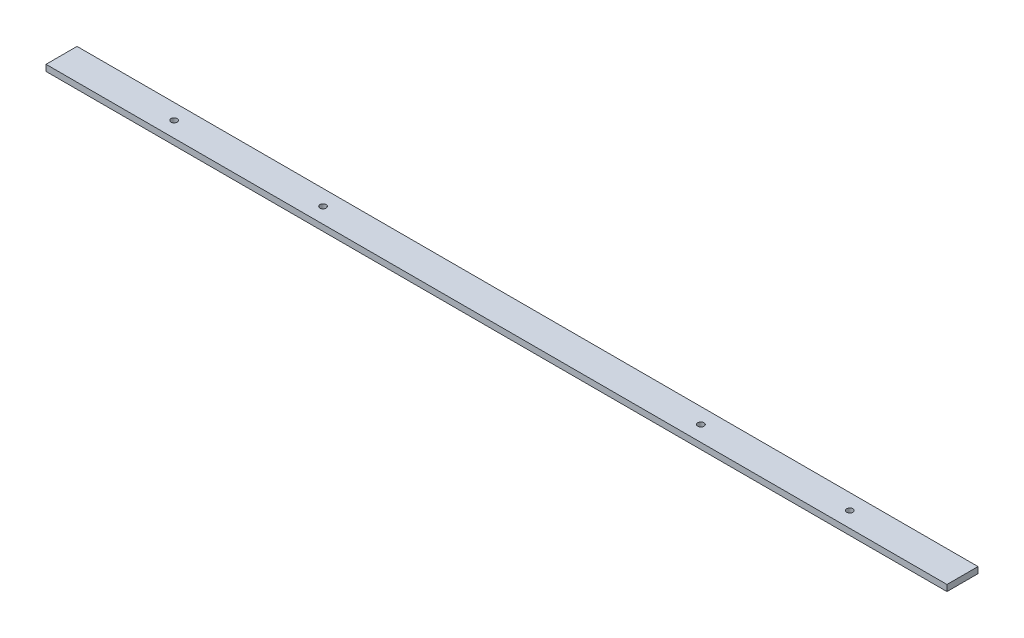
ISO-10303-21;
HEADER;
FILE_DESCRIPTION(('STEP AP214'),'2;1');
FILE_NAME('part.step','',(''),(''),'','','');
FILE_SCHEMA(('AUTOMOTIVE_DESIGN { 1 0 10303 214 1 1 1 1 }'));
ENDSEC;
DATA;
#1=APPLICATION_CONTEXT('core data for automotive mechanical design processes');
#2=APPLICATION_PROTOCOL_DEFINITION('international standard','automotive_design',2000,#1);
#3=PRODUCT_CONTEXT('',#1,'mechanical');
#4=PRODUCT('Part','Part','',(#3));
#5=PRODUCT_RELATED_PRODUCT_CATEGORY('part','',(#4));
#6=PRODUCT_DEFINITION_FORMATION('','',#4);
#7=PRODUCT_DEFINITION_CONTEXT('part definition',#1,'design');
#8=PRODUCT_DEFINITION('design','',#6,#7);
#9=PRODUCT_DEFINITION_SHAPE('','',#8);
#10=(LENGTH_UNIT() NAMED_UNIT(*) SI_UNIT(.MILLI.,.METRE.));
#11=(NAMED_UNIT(*) PLANE_ANGLE_UNIT() SI_UNIT($,.RADIAN.));
#12=(NAMED_UNIT(*) SI_UNIT($,.STERADIAN.) SOLID_ANGLE_UNIT());
#13=UNCERTAINTY_MEASURE_WITH_UNIT(LENGTH_MEASURE(1.E-05),#10,'distance_accuracy_value','');
#14=(GEOMETRIC_REPRESENTATION_CONTEXT(3) GLOBAL_UNCERTAINTY_ASSIGNED_CONTEXT((#13)) GLOBAL_UNIT_ASSIGNED_CONTEXT((#10,
#11,#12)) REPRESENTATION_CONTEXT('',''));
#15=CARTESIAN_POINT('',(0.,0.,0.));
#16=DIRECTION('',(0.,0.,1.));
#17=DIRECTION('',(1.,0.,0.));
#18=AXIS2_PLACEMENT_3D('',#15,#16,#17);
#19=CARTESIAN_POINT('',(-45.7662531369506,-2.,0.));
#20=DIRECTION('',(-1.,0.,0.));
#21=DIRECTION('',(0.,0.,1.));
#22=AXIS2_PLACEMENT_3D('',#19,#20,#21);
#23=PLANE('',#22);
#24=DIRECTION('',(0.,0.,1.));
#25=VECTOR('',#24,1.);
#26=CARTESIAN_POINT('',(-45.7662531369506,0.,0.));
#27=LINE('',#26,#25);
#28=CARTESIAN_POINT('',(-45.7662531369506,0.,0.));
#29=VERTEX_POINT('',#28);
#30=CARTESIAN_POINT('',(-45.7662531369506,0.,10.));
#31=VERTEX_POINT('',#30);
#32=EDGE_CURVE('E103',#29,#31,#27,.T.);
#33=ORIENTED_EDGE('',*,*,#32,.F.);
#34=DIRECTION('',(0.,1.,0.));
#35=VECTOR('',#34,1.);
#36=CARTESIAN_POINT('',(-45.7662531369506,-2.,0.));
#37=LINE('',#36,#35);
#38=CARTESIAN_POINT('',(-45.7662531369506,-2.,0.));
#39=VERTEX_POINT('',#38);
#40=EDGE_CURVE('E11',#39,#29,#37,.T.);
#41=ORIENTED_EDGE('',*,*,#40,.F.);
#42=DIRECTION('',(0.,0.,1.));
#43=VECTOR('',#42,1.);
#44=CARTESIAN_POINT('',(-45.7662531369506,-2.,0.));
#45=LINE('',#44,#43);
#46=CARTESIAN_POINT('',(-45.7662531369506,-2.,10.));
#47=VERTEX_POINT('',#46);
#48=EDGE_CURVE('E96',#39,#47,#45,.T.);
#49=ORIENTED_EDGE('',*,*,#48,.T.);
#50=DIRECTION('',(0.,1.,0.));
#51=VECTOR('',#50,1.);
#52=CARTESIAN_POINT('',(-45.7662531369506,-2.,10.));
#53=LINE('',#52,#51);
#54=EDGE_CURVE('E41',#47,#31,#53,.T.);
#55=ORIENTED_EDGE('',*,*,#54,.T.);
#56=EDGE_LOOP('',(#33,#41,#49,#55));
#57=FACE_BOUND('',#56,.T.);
#58=ADVANCED_FACE('F38',(#57),#23,.T.);
#59=CARTESIAN_POINT('',(-45.7662531369506,-2.,0.));
#60=DIRECTION('',(0.,0.,-1.));
#61=DIRECTION('',(-1.,0.,0.));
#62=AXIS2_PLACEMENT_3D('',#59,#60,#61);
#63=PLANE('',#62);
#64=DIRECTION('',(-1.,0.,0.));
#65=VECTOR('',#64,1.);
#66=CARTESIAN_POINT('',(-45.7662531369506,0.,0.));
#67=LINE('',#66,#65);
#68=CARTESIAN_POINT('',(244.583746863049,0.,0.));
#69=VERTEX_POINT('',#68);
#70=EDGE_CURVE('E98',#69,#29,#67,.T.);
#71=ORIENTED_EDGE('',*,*,#70,.F.);
#72=DIRECTION('',(0.,1.,0.));
#73=VECTOR('',#72,1.);
#74=CARTESIAN_POINT('',(244.583746863049,-2.,0.));
#75=LINE('',#74,#73);
#76=CARTESIAN_POINT('',(244.583746863049,-2.,0.));
#77=VERTEX_POINT('',#76);
#78=EDGE_CURVE('E47',#77,#69,#75,.T.);
#79=ORIENTED_EDGE('',*,*,#78,.F.);
#80=DIRECTION('',(-1.,0.,0.));
#81=VECTOR('',#80,1.);
#82=CARTESIAN_POINT('',(-45.7662531369506,-2.,0.));
#83=LINE('',#82,#81);
#84=EDGE_CURVE('E93',#77,#39,#83,.T.);
#85=ORIENTED_EDGE('',*,*,#84,.T.);
#86=ORIENTED_EDGE('',*,*,#40,.T.);
#87=EDGE_LOOP('',(#71,#79,#85,#86));
#88=FACE_BOUND('',#87,.T.);
#89=ADVANCED_FACE('F114',(#88),#63,.T.);
#90=CARTESIAN_POINT('',(244.583746863049,-2.,0.));
#91=DIRECTION('',(1.,0.,0.));
#92=DIRECTION('',(0.,0.,-1.));
#93=AXIS2_PLACEMENT_3D('',#90,#91,#92);
#94=PLANE('',#93);
#95=DIRECTION('',(0.,0.,-1.));
#96=VECTOR('',#95,1.);
#97=CARTESIAN_POINT('',(244.583746863049,0.,0.));
#98=LINE('',#97,#96);
#99=CARTESIAN_POINT('',(244.583746863049,0.,10.));
#100=VERTEX_POINT('',#99);
#101=EDGE_CURVE('E88',#100,#69,#98,.T.);
#102=ORIENTED_EDGE('',*,*,#101,.F.);
#103=DIRECTION('',(0.,1.,0.));
#104=VECTOR('',#103,1.);
#105=CARTESIAN_POINT('',(244.583746863049,-2.,10.));
#106=LINE('',#105,#104);
#107=CARTESIAN_POINT('',(244.583746863049,-2.,10.));
#108=VERTEX_POINT('',#107);
#109=EDGE_CURVE('E83',#108,#100,#106,.T.);
#110=ORIENTED_EDGE('',*,*,#109,.F.);
#111=DIRECTION('',(0.,0.,-1.));
#112=VECTOR('',#111,1.);
#113=CARTESIAN_POINT('',(244.583746863049,-2.,0.));
#114=LINE('',#113,#112);
#115=EDGE_CURVE('E86',#108,#77,#114,.T.);
#116=ORIENTED_EDGE('',*,*,#115,.T.);
#117=ORIENTED_EDGE('',*,*,#78,.T.);
#118=EDGE_LOOP('',(#102,#110,#116,#117));
#119=FACE_BOUND('',#118,.T.);
#120=ADVANCED_FACE('F85',(#119),#94,.T.);
#121=CARTESIAN_POINT('',(-45.7662531369506,-2.,10.));
#122=DIRECTION('',(0.,0.,1.));
#123=DIRECTION('',(1.,0.,0.));
#124=AXIS2_PLACEMENT_3D('',#121,#122,#123);
#125=PLANE('',#124);
#126=DIRECTION('',(1.,0.,0.));
#127=VECTOR('',#126,1.);
#128=CARTESIAN_POINT('',(-45.7662531369506,0.,10.));
#129=LINE('',#128,#127);
#130=EDGE_CURVE('E106',#31,#100,#129,.T.);
#131=ORIENTED_EDGE('',*,*,#130,.F.);
#132=ORIENTED_EDGE('',*,*,#54,.F.);
#133=DIRECTION('',(1.,0.,0.));
#134=VECTOR('',#133,1.);
#135=CARTESIAN_POINT('',(-45.7662531369506,-2.,10.));
#136=LINE('',#135,#134);
#137=EDGE_CURVE('E92',#47,#108,#136,.T.);
#138=ORIENTED_EDGE('',*,*,#137,.T.);
#139=ORIENTED_EDGE('',*,*,#109,.T.);
#140=EDGE_LOOP('',(#131,#132,#138,#139));
#141=FACE_BOUND('',#140,.T.);
#142=ADVANCED_FACE('F95',(#141),#125,.T.);
#143=CARTESIAN_POINT('',(0.,-2.,0.));
#144=DIRECTION('',(0.,1.,0.));
#145=DIRECTION('',(0.,0.,1.));
#146=AXIS2_PLACEMENT_3D('',#143,#144,#145);
#147=PLANE('',#146);
#148=CARTESIAN_POINT('',(-9.47125313695061,-2.,5.00000000000004));
#149=DIRECTION('',(0.,1.,0.));
#150=DIRECTION('',(0.,0.,1.));
#151=AXIS2_PLACEMENT_3D('',#148,#149,#150);
#152=CIRCLE('',#151,1.);
#153=CARTESIAN_POINT('',(-9.47125313695061,-2.,6.00000000000004));
#154=VERTEX_POINT('',#153);
#155=EDGE_CURVE('E107',#154,#154,#152,.T.);
#156=ORIENTED_EDGE('',*,*,#155,.T.);
#157=EDGE_LOOP('',(#156));
#158=FACE_BOUND('',#157,.T.);
#159=CARTESIAN_POINT('',(38.5287468630494,-2.,5.00000000000003));
#160=DIRECTION('',(0.,1.,0.));
#161=DIRECTION('',(0.,0.,1.));
#162=AXIS2_PLACEMENT_3D('',#159,#160,#161);
#163=CIRCLE('',#162,0.999999999999998);
#164=CARTESIAN_POINT('',(38.5287468630494,-2.,6.00000000000003));
#165=VERTEX_POINT('',#164);
#166=EDGE_CURVE('E158',#165,#165,#163,.T.);
#167=ORIENTED_EDGE('',*,*,#166,.T.);
#168=EDGE_LOOP('',(#167));
#169=FACE_BOUND('',#168,.T.);
#170=CARTESIAN_POINT('',(160.288746863049,-2.,5.00000000000003));
#171=DIRECTION('',(0.,1.,0.));
#172=DIRECTION('',(0.,0.,1.));
#173=AXIS2_PLACEMENT_3D('',#170,#171,#172);
#174=CIRCLE('',#173,0.999999999999998);
#175=CARTESIAN_POINT('',(160.288746863049,-2.,6.00000000000003));
#176=VERTEX_POINT('',#175);
#177=EDGE_CURVE('E160',#176,#176,#174,.T.);
#178=ORIENTED_EDGE('',*,*,#177,.T.);
#179=EDGE_LOOP('',(#178));
#180=FACE_BOUND('',#179,.T.);
#181=CARTESIAN_POINT('',(208.288746863049,-2.,5.00000000000004));
#182=DIRECTION('',(0.,1.,0.));
#183=DIRECTION('',(0.,0.,1.));
#184=AXIS2_PLACEMENT_3D('',#181,#182,#183);
#185=CIRCLE('',#184,0.999999999999998);
#186=CARTESIAN_POINT('',(208.288746863049,-2.,6.00000000000003));
#187=VERTEX_POINT('',#186);
#188=EDGE_CURVE('E165',#187,#187,#185,.T.);
#189=ORIENTED_EDGE('',*,*,#188,.T.);
#190=EDGE_LOOP('',(#189));
#191=FACE_BOUND('',#190,.T.);
#192=ORIENTED_EDGE('',*,*,#48,.F.);
#193=ORIENTED_EDGE('',*,*,#84,.F.);
#194=ORIENTED_EDGE('',*,*,#115,.F.);
#195=ORIENTED_EDGE('',*,*,#137,.F.);
#196=EDGE_LOOP('',(#192,#193,#194,#195));
#197=FACE_BOUND('',#196,.T.);
#198=ADVANCED_FACE('F91',(#158,#169,#180,#191,#197),#147,.F.);
#199=CARTESIAN_POINT('',(0.,0.,0.));
#200=DIRECTION('',(0.,1.,0.));
#201=DIRECTION('',(0.,0.,1.));
#202=AXIS2_PLACEMENT_3D('',#199,#200,#201);
#203=PLANE('',#202);
#204=CARTESIAN_POINT('',(-9.47125313695061,0.,5.00000000000004));
#205=DIRECTION('',(0.,1.,0.));
#206=DIRECTION('',(0.,0.,1.));
#207=AXIS2_PLACEMENT_3D('',#204,#205,#206);
#208=CIRCLE('',#207,1.);
#209=CARTESIAN_POINT('',(-9.47125313695061,0.,6.00000000000004));
#210=VERTEX_POINT('',#209);
#211=EDGE_CURVE('E156',#210,#210,#208,.T.);
#212=ORIENTED_EDGE('',*,*,#211,.F.);
#213=EDGE_LOOP('',(#212));
#214=FACE_BOUND('',#213,.T.);
#215=CARTESIAN_POINT('',(38.5287468630494,0.,5.00000000000003));
#216=DIRECTION('',(0.,1.,0.));
#217=DIRECTION('',(0.,0.,1.));
#218=AXIS2_PLACEMENT_3D('',#215,#216,#217);
#219=CIRCLE('',#218,0.999999999999998);
#220=CARTESIAN_POINT('',(38.5287468630494,0.,6.00000000000003));
#221=VERTEX_POINT('',#220);
#222=EDGE_CURVE('E174',#221,#221,#219,.T.);
#223=ORIENTED_EDGE('',*,*,#222,.F.);
#224=EDGE_LOOP('',(#223));
#225=FACE_BOUND('',#224,.T.);
#226=CARTESIAN_POINT('',(160.288746863049,0.,5.00000000000003));
#227=DIRECTION('',(0.,1.,0.));
#228=DIRECTION('',(0.,0.,-1.));
#229=AXIS2_PLACEMENT_3D('',#226,#227,#228);
#230=CIRCLE('',#229,0.999999999999998);
#231=CARTESIAN_POINT('',(160.288746863049,0.,4.00000000000004));
#232=VERTEX_POINT('',#231);
#233=EDGE_CURVE('E171',#232,#232,#230,.T.);
#234=ORIENTED_EDGE('',*,*,#233,.F.);
#235=EDGE_LOOP('',(#234));
#236=FACE_BOUND('',#235,.T.);
#237=CARTESIAN_POINT('',(208.288746863049,0.,5.00000000000004));
#238=DIRECTION('',(0.,1.,0.));
#239=DIRECTION('',(0.,0.,-1.));
#240=AXIS2_PLACEMENT_3D('',#237,#238,#239);
#241=CIRCLE('',#240,0.999999999999998);
#242=CARTESIAN_POINT('',(208.288746863049,0.,4.00000000000004));
#243=VERTEX_POINT('',#242);
#244=EDGE_CURVE('E168',#243,#243,#241,.T.);
#245=ORIENTED_EDGE('',*,*,#244,.F.);
#246=EDGE_LOOP('',(#245));
#247=FACE_BOUND('',#246,.T.);
#248=ORIENTED_EDGE('',*,*,#32,.T.);
#249=ORIENTED_EDGE('',*,*,#130,.T.);
#250=ORIENTED_EDGE('',*,*,#101,.T.);
#251=ORIENTED_EDGE('',*,*,#70,.T.);
#252=EDGE_LOOP('',(#248,#249,#250,#251));
#253=FACE_BOUND('',#252,.T.);
#254=ADVANCED_FACE('F113',(#214,#225,#236,#247,#253),#203,.T.);
#255=CARTESIAN_POINT('',(208.288746863049,-10.,5.00000000000004));
#256=DIRECTION('',(0.,1.,0.));
#257=DIRECTION('',(0.,0.,1.));
#258=AXIS2_PLACEMENT_3D('',#255,#256,#257);
#259=CYLINDRICAL_SURFACE('',#258,0.999999999999998);
#260=ORIENTED_EDGE('',*,*,#244,.T.);
#261=EDGE_LOOP('',(#260));
#262=FACE_BOUND('',#261,.T.);
#263=ORIENTED_EDGE('',*,*,#188,.F.);
#264=EDGE_LOOP('',(#263));
#265=FACE_BOUND('',#264,.T.);
#266=ADVANCED_FACE('F132',(#262,#265),#259,.F.);
#267=CARTESIAN_POINT('',(160.288746863049,-10.,5.00000000000003));
#268=DIRECTION('',(0.,1.,0.));
#269=DIRECTION('',(0.,0.,1.));
#270=AXIS2_PLACEMENT_3D('',#267,#268,#269);
#271=CYLINDRICAL_SURFACE('',#270,0.999999999999998);
#272=ORIENTED_EDGE('',*,*,#233,.T.);
#273=EDGE_LOOP('',(#272));
#274=FACE_BOUND('',#273,.T.);
#275=ORIENTED_EDGE('',*,*,#177,.F.);
#276=EDGE_LOOP('',(#275));
#277=FACE_BOUND('',#276,.T.);
#278=ADVANCED_FACE('F139',(#274,#277),#271,.F.);
#279=CARTESIAN_POINT('',(38.5287468630494,-10.,5.00000000000003));
#280=DIRECTION('',(0.,1.,0.));
#281=DIRECTION('',(0.,0.,1.));
#282=AXIS2_PLACEMENT_3D('',#279,#280,#281);
#283=CYLINDRICAL_SURFACE('',#282,0.999999999999998);
#284=ORIENTED_EDGE('',*,*,#222,.T.);
#285=EDGE_LOOP('',(#284));
#286=FACE_BOUND('',#285,.T.);
#287=ORIENTED_EDGE('',*,*,#166,.F.);
#288=EDGE_LOOP('',(#287));
#289=FACE_BOUND('',#288,.T.);
#290=ADVANCED_FACE('F143',(#286,#289),#283,.F.);
#291=CARTESIAN_POINT('',(-9.47125313695061,-10.,5.00000000000004));
#292=DIRECTION('',(0.,1.,0.));
#293=DIRECTION('',(0.,0.,1.));
#294=AXIS2_PLACEMENT_3D('',#291,#292,#293);
#295=CYLINDRICAL_SURFACE('',#294,1.);
#296=ORIENTED_EDGE('',*,*,#211,.T.);
#297=EDGE_LOOP('',(#296));
#298=FACE_BOUND('',#297,.T.);
#299=ORIENTED_EDGE('',*,*,#155,.F.);
#300=EDGE_LOOP('',(#299));
#301=FACE_BOUND('',#300,.T.);
#302=ADVANCED_FACE('F147',(#298,#301),#295,.F.);
#303=CLOSED_SHELL('',(#58,#89,#120,#142,#198,#254,#266,#278,#290,#302));
#304=MANIFOLD_SOLID_BREP('B2',#303);
#305=ADVANCED_BREP_SHAPE_REPRESENTATION('',(#18,#304),#14);
#306=SHAPE_DEFINITION_REPRESENTATION(#9,#305);
ENDSEC;
END-ISO-10303-21;
